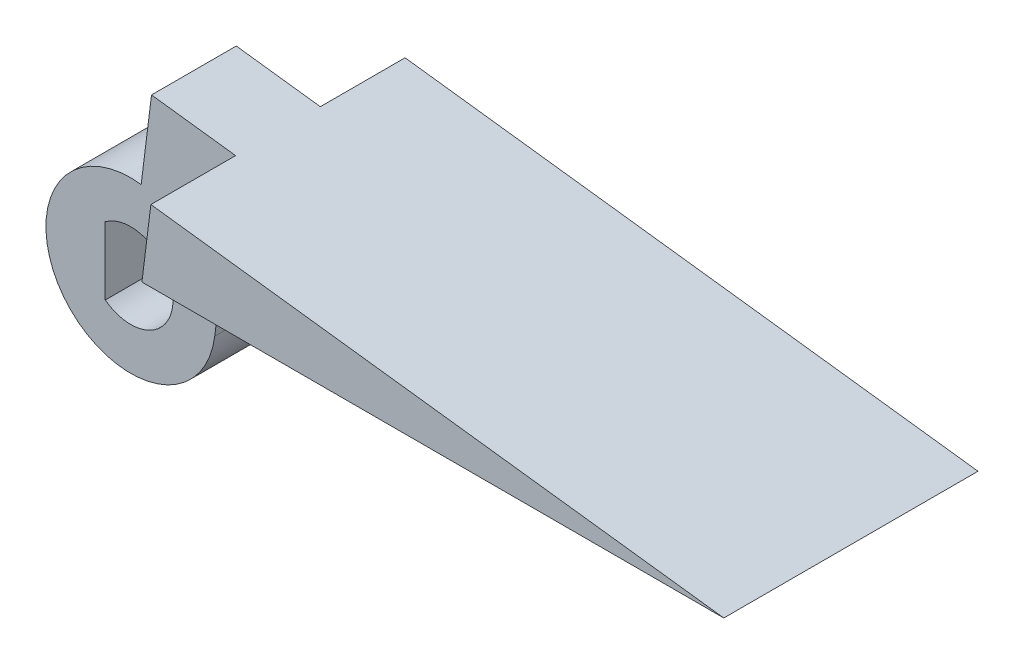
ISO-10303-21;
HEADER;
FILE_DESCRIPTION(('STEP AP214'),'2;1');
FILE_NAME('part.step','',(''),(''),'','','');
FILE_SCHEMA(('AUTOMOTIVE_DESIGN { 1 0 10303 214 1 1 1 1 }'));
ENDSEC;
DATA;
#1=APPLICATION_CONTEXT('core data for automotive mechanical design processes');
#2=APPLICATION_PROTOCOL_DEFINITION('international standard','automotive_design',2000,#1);
#3=PRODUCT_CONTEXT('',#1,'mechanical');
#4=PRODUCT('Part','Part','',(#3));
#5=PRODUCT_RELATED_PRODUCT_CATEGORY('part','',(#4));
#6=PRODUCT_DEFINITION_FORMATION('','',#4);
#7=PRODUCT_DEFINITION_CONTEXT('part definition',#1,'design');
#8=PRODUCT_DEFINITION('design','',#6,#7);
#9=PRODUCT_DEFINITION_SHAPE('','',#8);
#10=(LENGTH_UNIT() NAMED_UNIT(*) SI_UNIT(.MILLI.,.METRE.));
#11=(NAMED_UNIT(*) PLANE_ANGLE_UNIT() SI_UNIT($,.RADIAN.));
#12=(NAMED_UNIT(*) SI_UNIT($,.STERADIAN.) SOLID_ANGLE_UNIT());
#13=UNCERTAINTY_MEASURE_WITH_UNIT(LENGTH_MEASURE(1.E-05),#10,'distance_accuracy_value','');
#14=(GEOMETRIC_REPRESENTATION_CONTEXT(3) GLOBAL_UNCERTAINTY_ASSIGNED_CONTEXT((#13)) GLOBAL_UNIT_ASSIGNED_CONTEXT((#10,
#11,#12)) REPRESENTATION_CONTEXT('',''));
#15=CARTESIAN_POINT('',(0.,0.,0.));
#16=DIRECTION('',(0.,0.,1.));
#17=DIRECTION('',(1.,0.,0.));
#18=AXIS2_PLACEMENT_3D('',#15,#16,#17);
#19=CARTESIAN_POINT('',(0.,0.,-9.525));
#20=DIRECTION('',(0.,0.,1.));
#21=DIRECTION('',(1.,0.,0.));
#22=AXIS2_PLACEMENT_3D('',#19,#20,#21);
#23=PLANE('',#22);
#24=DIRECTION('',(0.124034734589208,0.992277876713668,0.));
#25=VECTOR('',#24,1.);
#26=CARTESIAN_POINT('',(6.30096451713179,-0.787620564641472,-9.525));
#27=LINE('',#26,#25);
#28=CARTESIAN_POINT('',(7.19316708771197,6.35,-9.525));
#29=VERTEX_POINT('',#28);
#30=CARTESIAN_POINT('',(7.86404144020871,11.7169948199739,-9.525));
#31=VERTEX_POINT('',#30);
#32=EDGE_CURVE('E152',#29,#31,#27,.T.);
#33=ORIENTED_EDGE('',*,*,#32,.T.);
#34=DIRECTION('',(-0.992277876713668,0.124034734589208,0.));
#35=VECTOR('',#34,1.);
#36=CARTESIAN_POINT('',(0.781538461538458,12.6023076923077,-9.525));
#37=LINE('',#36,#35);
#38=CARTESIAN_POINT('',(50.8,6.35,-9.525));
#39=VERTEX_POINT('',#38);
#40=EDGE_CURVE('E180',#39,#31,#37,.T.);
#41=ORIENTED_EDGE('',*,*,#40,.F.);
#42=DIRECTION('',(1.,0.,0.));
#43=VECTOR('',#42,1.);
#44=CARTESIAN_POINT('',(50.8,6.35,-9.525));
#45=LINE('',#44,#43);
#46=EDGE_CURVE('E176',#29,#39,#45,.T.);
#47=ORIENTED_EDGE('',*,*,#46,.F.);
#48=EDGE_LOOP('',(#33,#41,#47));
#49=FACE_BOUND('',#48,.T.);
#50=ADVANCED_FACE('F42',(#49),#23,.F.);
#51=CARTESIAN_POINT('',(0.781538461538458,12.6023076923077,9.525));
#52=DIRECTION('',(-0.124034734589208,-0.992277876713668,0.));
#53=DIRECTION('',(0.992277876713668,-0.124034734589208,0.));
#54=AXIS2_PLACEMENT_3D('',#51,#52,#53);
#55=PLANE('',#54);
#56=DIRECTION('',(-0.992277876713668,0.124034734589208,0.));
#57=VECTOR('',#56,1.);
#58=CARTESIAN_POINT('',(0.781538461538458,12.6023076923077,-3.175));
#59=LINE('',#58,#57);
#60=CARTESIAN_POINT('',(7.86404144020871,11.7169948199739,-3.175));
#61=VERTEX_POINT('',#60);
#62=CARTESIAN_POINT('',(1.56307692307693,12.5046153846154,-3.175));
#63=VERTEX_POINT('',#62);
#64=EDGE_CURVE('E200',#61,#63,#59,.T.);
#65=ORIENTED_EDGE('',*,*,#64,.T.);
#66=DIRECTION('',(0.,0.,1.));
#67=VECTOR('',#66,1.);
#68=CARTESIAN_POINT('',(1.56307692307693,12.5046153846154,-9.525));
#69=LINE('',#68,#67);
#70=CARTESIAN_POINT('',(1.56307692307693,12.5046153846154,3.175));
#71=VERTEX_POINT('',#70);
#72=EDGE_CURVE('E135',#63,#71,#69,.T.);
#73=ORIENTED_EDGE('',*,*,#72,.T.);
#74=DIRECTION('',(-0.992277876713668,0.124034734589208,0.));
#75=VECTOR('',#74,1.);
#76=CARTESIAN_POINT('',(0.781538461538458,12.6023076923077,3.175));
#77=LINE('',#76,#75);
#78=CARTESIAN_POINT('',(7.86404144020871,11.7169948199739,3.175));
#79=VERTEX_POINT('',#78);
#80=EDGE_CURVE('E129',#79,#71,#77,.T.);
#81=ORIENTED_EDGE('',*,*,#80,.F.);
#82=DIRECTION('',(0.,0.,1.));
#83=VECTOR('',#82,1.);
#84=CARTESIAN_POINT('',(7.86404144020871,11.7169948199739,9.525));
#85=LINE('',#84,#83);
#86=CARTESIAN_POINT('',(7.86404144020871,11.7169948199739,9.525));
#87=VERTEX_POINT('',#86);
#88=EDGE_CURVE('E195',#79,#87,#85,.T.);
#89=ORIENTED_EDGE('',*,*,#88,.T.);
#90=DIRECTION('',(-0.992277876713668,0.124034734589208,0.));
#91=VECTOR('',#90,1.);
#92=CARTESIAN_POINT('',(6.30096451713179,11.9123794353585,9.525));
#93=LINE('',#92,#91);
#94=CARTESIAN_POINT('',(50.8,6.35,9.525));
#95=VERTEX_POINT('',#94);
#96=EDGE_CURVE('E179',#95,#87,#93,.T.);
#97=ORIENTED_EDGE('',*,*,#96,.F.);
#98=DIRECTION('',(0.,0.,-1.));
#99=VECTOR('',#98,1.);
#100=CARTESIAN_POINT('',(50.8,6.35,9.525));
#101=LINE('',#100,#99);
#102=EDGE_CURVE('E183',#95,#39,#101,.T.);
#103=ORIENTED_EDGE('',*,*,#102,.T.);
#104=ORIENTED_EDGE('',*,*,#40,.T.);
#105=DIRECTION('',(0.,0.,-1.));
#106=VECTOR('',#105,1.);
#107=CARTESIAN_POINT('',(7.86404144020871,11.7169948199739,9.525));
#108=LINE('',#107,#106);
#109=EDGE_CURVE('E50',#61,#31,#108,.T.);
#110=ORIENTED_EDGE('',*,*,#109,.F.);
#111=EDGE_LOOP('',(#65,#73,#81,#89,#97,#103,#104,#110));
#112=FACE_BOUND('',#111,.T.);
#113=ADVANCED_FACE('F209',(#112),#55,.F.);
#114=CARTESIAN_POINT('',(6.30096451713179,-0.787620564641475,9.525));
#115=DIRECTION('',(-0.992277876713668,0.124034734589208,0.));
#116=DIRECTION('',(-0.124034734589208,-0.992277876713668,0.));
#117=AXIS2_PLACEMENT_3D('',#114,#115,#116);
#118=PLANE('',#117);
#119=DIRECTION('',(0.,0.,-1.));
#120=VECTOR('',#119,1.);
#121=CARTESIAN_POINT('',(6.30096451713179,-0.787620564641475,9.525));
#122=LINE('',#121,#120);
#123=CARTESIAN_POINT('',(6.30096451713179,-0.787620564641475,3.175));
#124=VERTEX_POINT('',#123);
#125=CARTESIAN_POINT('',(6.30096451713179,-0.787620564641475,-3.175));
#126=VERTEX_POINT('',#125);
#127=EDGE_CURVE('E124',#124,#126,#122,.T.);
#128=ORIENTED_EDGE('',*,*,#127,.T.);
#129=DIRECTION('',(0.124034734589208,0.992277876713668,0.));
#130=VECTOR('',#129,1.);
#131=CARTESIAN_POINT('',(6.30096451713179,-0.787620564641475,-3.175));
#132=LINE('',#131,#130);
#133=CARTESIAN_POINT('',(7.19316708771197,6.35,-3.175));
#134=VERTEX_POINT('',#133);
#135=EDGE_CURVE('E164',#126,#134,#132,.T.);
#136=ORIENTED_EDGE('',*,*,#135,.T.);
#137=DIRECTION('',(0.,0.,-1.));
#138=VECTOR('',#137,1.);
#139=CARTESIAN_POINT('',(7.19316708771197,6.34999999999999,9.525));
#140=LINE('',#139,#138);
#141=CARTESIAN_POINT('',(7.19316708771197,6.34999999999999,3.175));
#142=VERTEX_POINT('',#141);
#143=EDGE_CURVE('E190',#142,#134,#140,.T.);
#144=ORIENTED_EDGE('',*,*,#143,.F.);
#145=DIRECTION('',(0.124034734589208,0.992277876713668,0.));
#146=VECTOR('',#145,1.);
#147=CARTESIAN_POINT('',(6.30096451713179,-0.787620564641475,3.175));
#148=LINE('',#147,#146);
#149=EDGE_CURVE('E128',#124,#142,#148,.T.);
#150=ORIENTED_EDGE('',*,*,#149,.F.);
#151=EDGE_LOOP('',(#128,#136,#144,#150));
#152=FACE_BOUND('',#151,.T.);
#153=ADVANCED_FACE('F44',(#152),#118,.F.);
#154=CARTESIAN_POINT('',(0.,0.,9.525));
#155=DIRECTION('',(0.,0.,-1.));
#156=DIRECTION('',(-1.,0.,0.));
#157=AXIS2_PLACEMENT_3D('',#154,#155,#156);
#158=CYLINDRICAL_SURFACE('',#157,6.35);
#159=ORIENTED_EDGE('',*,*,#127,.F.);
#160=CARTESIAN_POINT('',(0.,0.,3.175));
#161=DIRECTION('',(0.,0.,1.));
#162=DIRECTION('',(1.,0.,0.));
#163=AXIS2_PLACEMENT_3D('',#160,#161,#162);
#164=CIRCLE('',#163,6.35);
#165=CARTESIAN_POINT('',(0.787620564641476,6.30096451713179,3.175));
#166=VERTEX_POINT('',#165);
#167=EDGE_CURVE('E118',#166,#124,#164,.T.);
#168=ORIENTED_EDGE('',*,*,#167,.F.);
#169=DIRECTION('',(0.,0.,1.));
#170=VECTOR('',#169,1.);
#171=CARTESIAN_POINT('',(0.787620564641476,6.30096451713179,-9.525));
#172=LINE('',#171,#170);
#173=CARTESIAN_POINT('',(0.787620564641476,6.30096451713179,-3.175));
#174=VERTEX_POINT('',#173);
#175=EDGE_CURVE('E121',#174,#166,#172,.T.);
#176=ORIENTED_EDGE('',*,*,#175,.F.);
#177=CARTESIAN_POINT('',(0.,0.,-3.175));
#178=DIRECTION('',(0.,0.,1.));
#179=DIRECTION('',(1.,0.,0.));
#180=AXIS2_PLACEMENT_3D('',#177,#178,#179);
#181=CIRCLE('',#180,6.35);
#182=EDGE_CURVE('E56',#174,#126,#181,.T.);
#183=ORIENTED_EDGE('',*,*,#182,.T.);
#184=EDGE_LOOP('',(#159,#168,#176,#183));
#185=FACE_BOUND('',#184,.T.);
#186=ADVANCED_FACE('F120',(#185),#158,.T.);
#187=CARTESIAN_POINT('',(0.,0.,9.525));
#188=DIRECTION('',(0.,0.,-1.));
#189=DIRECTION('',(-1.,0.,0.));
#190=AXIS2_PLACEMENT_3D('',#187,#188,#189);
#191=CYLINDRICAL_SURFACE('',#190,3.175);
#192=DIRECTION('',(0.,0.,1.));
#193=VECTOR('',#192,1.);
#194=CARTESIAN_POINT('',(-1.905,-2.54,-3.175));
#195=LINE('',#194,#193);
#196=CARTESIAN_POINT('',(-1.905,-2.54,-3.175));
#197=VERTEX_POINT('',#196);
#198=CARTESIAN_POINT('',(-1.905,-2.54,3.175));
#199=VERTEX_POINT('',#198);
#200=EDGE_CURVE('E147',#197,#199,#195,.T.);
#201=ORIENTED_EDGE('',*,*,#200,.T.);
#202=CARTESIAN_POINT('',(0.,0.,3.175));
#203=DIRECTION('',(0.,0.,1.));
#204=DIRECTION('',(1.,0.,0.));
#205=AXIS2_PLACEMENT_3D('',#202,#203,#204);
#206=CIRCLE('',#205,3.175);
#207=CARTESIAN_POINT('',(-1.905,2.54,3.175));
#208=VERTEX_POINT('',#207);
#209=EDGE_CURVE('E172',#199,#208,#206,.T.);
#210=ORIENTED_EDGE('',*,*,#209,.T.);
#211=DIRECTION('',(0.,0.,1.));
#212=VECTOR('',#211,1.);
#213=CARTESIAN_POINT('',(-1.905,2.54,-3.175));
#214=LINE('',#213,#212);
#215=CARTESIAN_POINT('',(-1.905,2.54,-3.175));
#216=VERTEX_POINT('',#215);
#217=EDGE_CURVE('E150',#216,#208,#214,.T.);
#218=ORIENTED_EDGE('',*,*,#217,.F.);
#219=CARTESIAN_POINT('',(0.,0.,-3.175));
#220=DIRECTION('',(0.,0.,1.));
#221=DIRECTION('',(1.,0.,0.));
#222=AXIS2_PLACEMENT_3D('',#219,#220,#221);
#223=CIRCLE('',#222,3.175);
#224=EDGE_CURVE('E167',#197,#216,#223,.T.);
#225=ORIENTED_EDGE('',*,*,#224,.F.);
#226=EDGE_LOOP('',(#201,#210,#218,#225));
#227=FACE_BOUND('',#226,.T.);
#228=ADVANCED_FACE('F226',(#227),#191,.F.);
#229=CARTESIAN_POINT('',(0.,0.,9.525));
#230=DIRECTION('',(0.,0.,1.));
#231=DIRECTION('',(1.,0.,0.));
#232=AXIS2_PLACEMENT_3D('',#229,#230,#231);
#233=PLANE('',#232);
#234=DIRECTION('',(0.124034734589208,0.992277876713668,0.));
#235=VECTOR('',#234,1.);
#236=CARTESIAN_POINT('',(7.19316708771197,6.34999999999999,9.525));
#237=LINE('',#236,#235);
#238=CARTESIAN_POINT('',(7.19316708771197,6.34999999999999,9.525));
#239=VERTEX_POINT('',#238);
#240=EDGE_CURVE('E169',#239,#87,#237,.T.);
#241=ORIENTED_EDGE('',*,*,#240,.F.);
#242=DIRECTION('',(1.,0.,0.));
#243=VECTOR('',#242,1.);
#244=CARTESIAN_POINT('',(50.8,6.35,9.525));
#245=LINE('',#244,#243);
#246=EDGE_CURVE('E177',#239,#95,#245,.T.);
#247=ORIENTED_EDGE('',*,*,#246,.T.);
#248=ORIENTED_EDGE('',*,*,#96,.T.);
#249=EDGE_LOOP('',(#241,#247,#248));
#250=FACE_BOUND('',#249,.T.);
#251=ADVANCED_FACE('F224',(#250),#233,.T.);
#252=CARTESIAN_POINT('',(50.8,6.35,9.525));
#253=DIRECTION('',(0.,1.,0.));
#254=DIRECTION('',(-1.,0.,0.));
#255=AXIS2_PLACEMENT_3D('',#252,#253,#254);
#256=PLANE('',#255);
#257=ORIENTED_EDGE('',*,*,#46,.T.);
#258=ORIENTED_EDGE('',*,*,#102,.F.);
#259=ORIENTED_EDGE('',*,*,#246,.F.);
#260=EDGE_CURVE('E191',#239,#142,#140,.T.);
#261=ORIENTED_EDGE('',*,*,#260,.T.);
#262=ORIENTED_EDGE('',*,*,#143,.T.);
#263=DIRECTION('',(0.,0.,-1.));
#264=VECTOR('',#263,1.);
#265=CARTESIAN_POINT('',(7.19316708771197,6.35,-3.175));
#266=LINE('',#265,#264);
#267=EDGE_CURVE('E158',#134,#29,#266,.T.);
#268=ORIENTED_EDGE('',*,*,#267,.T.);
#269=EDGE_LOOP('',(#257,#258,#259,#261,#262,#268));
#270=FACE_BOUND('',#269,.T.);
#271=ADVANCED_FACE('F214',(#270),#256,.F.);
#272=CARTESIAN_POINT('',(7.19316708771197,6.34999999999999,3.175));
#273=DIRECTION('',(0.992277876713668,-0.124034734589208,0.));
#274=DIRECTION('',(0.124034734589208,0.992277876713668,0.));
#275=AXIS2_PLACEMENT_3D('',#272,#273,#274);
#276=PLANE('',#275);
#277=DIRECTION('',(0.124034734589208,0.992277876713668,0.));
#278=VECTOR('',#277,1.);
#279=CARTESIAN_POINT('',(7.19316708771197,6.34999999999999,3.175));
#280=LINE('',#279,#278);
#281=EDGE_CURVE('E170',#142,#79,#280,.T.);
#282=ORIENTED_EDGE('',*,*,#281,.F.);
#283=ORIENTED_EDGE('',*,*,#260,.F.);
#284=ORIENTED_EDGE('',*,*,#240,.T.);
#285=ORIENTED_EDGE('',*,*,#88,.F.);
#286=EDGE_LOOP('',(#282,#283,#284,#285));
#287=FACE_BOUND('',#286,.T.);
#288=ADVANCED_FACE('F221',(#287),#276,.F.);
#289=CARTESIAN_POINT('',(0.,0.,3.175));
#290=DIRECTION('',(0.,0.,1.));
#291=DIRECTION('',(1.,0.,0.));
#292=AXIS2_PLACEMENT_3D('',#289,#290,#291);
#293=PLANE('',#292);
#294=DIRECTION('',(0.124034734589209,0.992277876713668,0.));
#295=VECTOR('',#294,1.);
#296=CARTESIAN_POINT('',(0.787620564641476,6.30096451713179,3.175));
#297=LINE('',#296,#295);
#298=EDGE_CURVE('E133',#166,#71,#297,.T.);
#299=ORIENTED_EDGE('',*,*,#298,.F.);
#300=ORIENTED_EDGE('',*,*,#167,.T.);
#301=ORIENTED_EDGE('',*,*,#149,.T.);
#302=ORIENTED_EDGE('',*,*,#281,.T.);
#303=ORIENTED_EDGE('',*,*,#80,.T.);
#304=EDGE_LOOP('',(#299,#300,#301,#302,#303));
#305=FACE_BOUND('',#304,.T.);
#306=ORIENTED_EDGE('',*,*,#209,.F.);
#307=DIRECTION('',(0.,1.,0.));
#308=VECTOR('',#307,1.);
#309=CARTESIAN_POINT('',(-1.905,2.54,3.175));
#310=LINE('',#309,#308);
#311=EDGE_CURVE('E144',#199,#208,#310,.T.);
#312=ORIENTED_EDGE('',*,*,#311,.T.);
#313=EDGE_LOOP('',(#306,#312));
#314=FACE_BOUND('',#313,.T.);
#315=ADVANCED_FACE('F138',(#305,#314),#293,.T.);
#316=CARTESIAN_POINT('',(6.30096451713179,-0.787620564641472,-3.175));
#317=DIRECTION('',(-0.992277876713668,0.124034734589208,0.));
#318=DIRECTION('',(-0.124034734589208,-0.992277876713668,0.));
#319=AXIS2_PLACEMENT_3D('',#316,#317,#318);
#320=PLANE('',#319);
#321=ORIENTED_EDGE('',*,*,#109,.T.);
#322=ORIENTED_EDGE('',*,*,#32,.F.);
#323=ORIENTED_EDGE('',*,*,#267,.F.);
#324=DIRECTION('',(0.124034734589208,0.992277876713668,0.));
#325=VECTOR('',#324,1.);
#326=CARTESIAN_POINT('',(6.30096451713179,-0.787620564641472,-3.175));
#327=LINE('',#326,#325);
#328=EDGE_CURVE('E155',#134,#61,#327,.T.);
#329=ORIENTED_EDGE('',*,*,#328,.T.);
#330=EDGE_LOOP('',(#321,#322,#323,#329));
#331=FACE_BOUND('',#330,.T.);
#332=ADVANCED_FACE('F204',(#331),#320,.T.);
#333=CARTESIAN_POINT('',(0.,0.,-3.175));
#334=DIRECTION('',(0.,0.,1.));
#335=DIRECTION('',(1.,0.,0.));
#336=AXIS2_PLACEMENT_3D('',#333,#334,#335);
#337=PLANE('',#336);
#338=ORIENTED_EDGE('',*,*,#224,.T.);
#339=DIRECTION('',(0.,1.,0.));
#340=VECTOR('',#339,1.);
#341=CARTESIAN_POINT('',(-1.905,2.54,-3.175));
#342=LINE('',#341,#340);
#343=EDGE_CURVE('E63',#197,#216,#342,.T.);
#344=ORIENTED_EDGE('',*,*,#343,.F.);
#345=EDGE_LOOP('',(#338,#344));
#346=FACE_BOUND('',#345,.T.);
#347=ORIENTED_EDGE('',*,*,#182,.F.);
#348=DIRECTION('',(0.124034734589209,0.992277876713668,0.));
#349=VECTOR('',#348,1.);
#350=CARTESIAN_POINT('',(0.,0.,-3.175));
#351=LINE('',#350,#349);
#352=EDGE_CURVE('E11',#174,#63,#351,.T.);
#353=ORIENTED_EDGE('',*,*,#352,.T.);
#354=ORIENTED_EDGE('',*,*,#64,.F.);
#355=ORIENTED_EDGE('',*,*,#328,.F.);
#356=ORIENTED_EDGE('',*,*,#135,.F.);
#357=EDGE_LOOP('',(#347,#353,#354,#355,#356));
#358=FACE_BOUND('',#357,.T.);
#359=ADVANCED_FACE('F217',(#346,#358),#337,.F.);
#360=CARTESIAN_POINT('',(-1.905,2.54,-3.175));
#361=DIRECTION('',(1.,0.,0.));
#362=DIRECTION('',(0.,0.,-1.));
#363=AXIS2_PLACEMENT_3D('',#360,#361,#362);
#364=PLANE('',#363);
#365=ORIENTED_EDGE('',*,*,#311,.F.);
#366=ORIENTED_EDGE('',*,*,#200,.F.);
#367=ORIENTED_EDGE('',*,*,#343,.T.);
#368=ORIENTED_EDGE('',*,*,#217,.T.);
#369=EDGE_LOOP('',(#365,#366,#367,#368));
#370=FACE_BOUND('',#369,.T.);
#371=ADVANCED_FACE('F259',(#370),#364,.T.);
#372=CARTESIAN_POINT('',(0.787620564641476,6.30096451713179,-9.525));
#373=DIRECTION('',(0.992277876713668,-0.124034734589209,0.));
#374=DIRECTION('',(0.124034734589209,0.992277876713668,0.));
#375=AXIS2_PLACEMENT_3D('',#372,#373,#374);
#376=PLANE('',#375);
#377=ORIENTED_EDGE('',*,*,#175,.T.);
#378=ORIENTED_EDGE('',*,*,#298,.T.);
#379=ORIENTED_EDGE('',*,*,#72,.F.);
#380=ORIENTED_EDGE('',*,*,#352,.F.);
#381=EDGE_LOOP('',(#377,#378,#379,#380));
#382=FACE_BOUND('',#381,.T.);
#383=ADVANCED_FACE('F132',(#382),#376,.F.);
#384=CLOSED_SHELL('',(#50,#113,#153,#186,#228,#251,#271,#288,#315,#332,#359,#371,#383));
#385=MANIFOLD_SOLID_BREP('B2',#384);
#386=ADVANCED_BREP_SHAPE_REPRESENTATION('',(#18,#385),#14);
#387=SHAPE_DEFINITION_REPRESENTATION(#9,#386);
ENDSEC;
END-ISO-10303-21;
